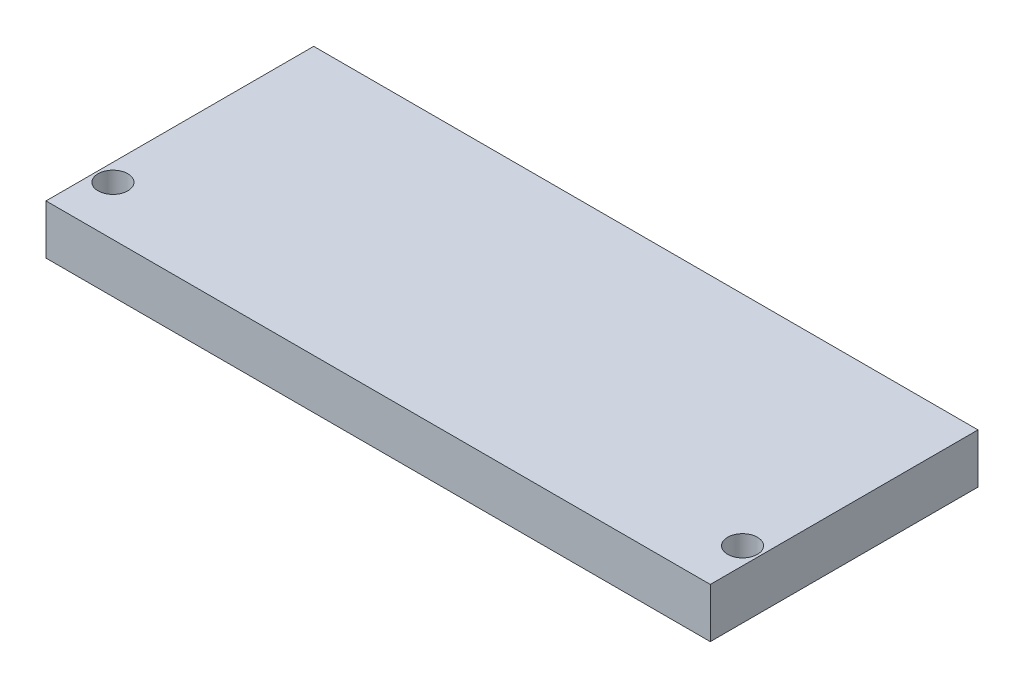
ISO-10303-21;
HEADER;
FILE_DESCRIPTION(('STEP AP214'),'2;1');
FILE_NAME('part.step','',(''),(''),'','','');
FILE_SCHEMA(('AUTOMOTIVE_DESIGN { 1 0 10303 214 1 1 1 1 }'));
ENDSEC;
DATA;
#1=APPLICATION_CONTEXT('core data for automotive mechanical design processes');
#2=APPLICATION_PROTOCOL_DEFINITION('international standard','automotive_design',2000,#1);
#3=PRODUCT_CONTEXT('',#1,'mechanical');
#4=PRODUCT('Part','Part','',(#3));
#5=PRODUCT_RELATED_PRODUCT_CATEGORY('part','',(#4));
#6=PRODUCT_DEFINITION_FORMATION('','',#4);
#7=PRODUCT_DEFINITION_CONTEXT('part definition',#1,'design');
#8=PRODUCT_DEFINITION('design','',#6,#7);
#9=PRODUCT_DEFINITION_SHAPE('','',#8);
#10=(LENGTH_UNIT() NAMED_UNIT(*) SI_UNIT(.MILLI.,.METRE.));
#11=(NAMED_UNIT(*) PLANE_ANGLE_UNIT() SI_UNIT($,.RADIAN.));
#12=(NAMED_UNIT(*) SI_UNIT($,.STERADIAN.) SOLID_ANGLE_UNIT());
#13=UNCERTAINTY_MEASURE_WITH_UNIT(LENGTH_MEASURE(1.E-05),#10,'distance_accuracy_value','');
#14=(GEOMETRIC_REPRESENTATION_CONTEXT(3) GLOBAL_UNCERTAINTY_ASSIGNED_CONTEXT((#13)) GLOBAL_UNIT_ASSIGNED_CONTEXT((#10,
#11,#12)) REPRESENTATION_CONTEXT('',''));
#15=CARTESIAN_POINT('',(0.,0.,0.));
#16=DIRECTION('',(0.,0.,1.));
#17=DIRECTION('',(1.,0.,0.));
#18=AXIS2_PLACEMENT_3D('',#15,#16,#17);
#19=CARTESIAN_POINT('',(0.,5.,0.));
#20=DIRECTION('',(0.,-1.,0.));
#21=DIRECTION('',(0.,0.,-1.));
#22=AXIS2_PLACEMENT_3D('',#19,#20,#21);
#23=PLANE('',#22);
#24=DIRECTION('',(0.,0.,-1.));
#25=VECTOR('',#24,1.);
#26=CARTESIAN_POINT('',(33.5,5.,13.5));
#27=LINE('',#26,#25);
#28=CARTESIAN_POINT('',(33.5,5.,13.5));
#29=VERTEX_POINT('',#28);
#30=CARTESIAN_POINT('',(33.5,5.,-13.5));
#31=VERTEX_POINT('',#30);
#32=EDGE_CURVE('E98',#29,#31,#27,.T.);
#33=ORIENTED_EDGE('',*,*,#32,.T.);
#34=DIRECTION('',(-1.,0.,0.));
#35=VECTOR('',#34,1.);
#36=CARTESIAN_POINT('',(-33.5,5.,-13.5));
#37=LINE('',#36,#35);
#38=CARTESIAN_POINT('',(-33.5,5.,-13.5));
#39=VERTEX_POINT('',#38);
#40=EDGE_CURVE('E93',#31,#39,#37,.T.);
#41=ORIENTED_EDGE('',*,*,#40,.T.);
#42=DIRECTION('',(0.,0.,1.));
#43=VECTOR('',#42,1.);
#44=CARTESIAN_POINT('',(-33.5,5.,13.5));
#45=LINE('',#44,#43);
#46=CARTESIAN_POINT('',(-33.5,5.,13.5));
#47=VERTEX_POINT('',#46);
#48=EDGE_CURVE('E96',#39,#47,#45,.T.);
#49=ORIENTED_EDGE('',*,*,#48,.T.);
#50=DIRECTION('',(1.,0.,0.));
#51=VECTOR('',#50,1.);
#52=CARTESIAN_POINT('',(-33.5,5.,13.5));
#53=LINE('',#52,#51);
#54=EDGE_CURVE('E63',#47,#29,#53,.T.);
#55=ORIENTED_EDGE('',*,*,#54,.T.);
#56=EDGE_LOOP('',(#33,#41,#49,#55));
#57=FACE_BOUND('',#56,.T.);
#58=CARTESIAN_POINT('',(-31.75,5.,8.5));
#59=DIRECTION('',(0.,1.,0.));
#60=DIRECTION('',(0.,0.,1.));
#61=AXIS2_PLACEMENT_3D('',#58,#59,#60);
#62=CIRCLE('',#61,1.5);
#63=CARTESIAN_POINT('',(-31.75,5.,10.));
#64=VERTEX_POINT('',#63);
#65=EDGE_CURVE('E118',#64,#64,#62,.T.);
#66=ORIENTED_EDGE('',*,*,#65,.F.);
#67=EDGE_LOOP('',(#66));
#68=FACE_BOUND('',#67,.T.);
#69=CARTESIAN_POINT('',(31.75,5.,8.5));
#70=DIRECTION('',(0.,1.,0.));
#71=DIRECTION('',(0.,0.,-1.));
#72=AXIS2_PLACEMENT_3D('',#69,#70,#71);
#73=CIRCLE('',#72,1.5);
#74=CARTESIAN_POINT('',(31.75,5.,7.));
#75=VERTEX_POINT('',#74);
#76=EDGE_CURVE('E140',#75,#75,#73,.T.);
#77=ORIENTED_EDGE('',*,*,#76,.F.);
#78=EDGE_LOOP('',(#77));
#79=FACE_BOUND('',#78,.T.);
#80=ADVANCED_FACE('F45',(#57,#68,#79),#23,.F.);
#81=CARTESIAN_POINT('',(0.,0.,0.));
#82=DIRECTION('',(0.,-1.,0.));
#83=DIRECTION('',(0.,0.,-1.));
#84=AXIS2_PLACEMENT_3D('',#81,#82,#83);
#85=PLANE('',#84);
#86=CARTESIAN_POINT('',(-31.75,0.,8.5));
#87=DIRECTION('',(0.,1.,0.));
#88=DIRECTION('',(0.,0.,1.));
#89=AXIS2_PLACEMENT_3D('',#86,#87,#88);
#90=CIRCLE('',#89,1.5);
#91=CARTESIAN_POINT('',(-31.75,0.,10.));
#92=VERTEX_POINT('',#91);
#93=EDGE_CURVE('E136',#92,#92,#90,.T.);
#94=ORIENTED_EDGE('',*,*,#93,.T.);
#95=EDGE_LOOP('',(#94));
#96=FACE_BOUND('',#95,.T.);
#97=DIRECTION('',(0.,0.,-1.));
#98=VECTOR('',#97,1.);
#99=CARTESIAN_POINT('',(33.5,0.,13.5));
#100=LINE('',#99,#98);
#101=CARTESIAN_POINT('',(33.5,0.,13.5));
#102=VERTEX_POINT('',#101);
#103=CARTESIAN_POINT('',(33.5,0.,-13.5));
#104=VERTEX_POINT('',#103);
#105=EDGE_CURVE('E114',#102,#104,#100,.T.);
#106=ORIENTED_EDGE('',*,*,#105,.F.);
#107=DIRECTION('',(1.,0.,0.));
#108=VECTOR('',#107,1.);
#109=CARTESIAN_POINT('',(-33.5,0.,13.5));
#110=LINE('',#109,#108);
#111=CARTESIAN_POINT('',(-33.5,0.,13.5));
#112=VERTEX_POINT('',#111);
#113=EDGE_CURVE('E86',#112,#102,#110,.T.);
#114=ORIENTED_EDGE('',*,*,#113,.F.);
#115=DIRECTION('',(0.,0.,1.));
#116=VECTOR('',#115,1.);
#117=CARTESIAN_POINT('',(-33.5,0.,13.5));
#118=LINE('',#117,#116);
#119=CARTESIAN_POINT('',(-33.5,0.,-13.5));
#120=VERTEX_POINT('',#119);
#121=EDGE_CURVE('E80',#120,#112,#118,.T.);
#122=ORIENTED_EDGE('',*,*,#121,.F.);
#123=DIRECTION('',(-1.,0.,0.));
#124=VECTOR('',#123,1.);
#125=CARTESIAN_POINT('',(-33.5,0.,-13.5));
#126=LINE('',#125,#124);
#127=EDGE_CURVE('E103',#104,#120,#126,.T.);
#128=ORIENTED_EDGE('',*,*,#127,.F.);
#129=EDGE_LOOP('',(#106,#114,#122,#128));
#130=FACE_BOUND('',#129,.T.);
#131=CARTESIAN_POINT('',(31.75,0.,8.5));
#132=DIRECTION('',(0.,1.,0.));
#133=DIRECTION('',(0.,0.,-1.));
#134=AXIS2_PLACEMENT_3D('',#131,#132,#133);
#135=CIRCLE('',#134,1.5);
#136=CARTESIAN_POINT('',(31.75,0.,7.));
#137=VERTEX_POINT('',#136);
#138=EDGE_CURVE('E144',#137,#137,#135,.T.);
#139=ORIENTED_EDGE('',*,*,#138,.T.);
#140=EDGE_LOOP('',(#139));
#141=FACE_BOUND('',#140,.T.);
#142=ADVANCED_FACE('F131',(#96,#130,#141),#85,.T.);
#143=CARTESIAN_POINT('',(33.5,5.,13.5));
#144=DIRECTION('',(-1.,0.,0.));
#145=DIRECTION('',(0.,0.,1.));
#146=AXIS2_PLACEMENT_3D('',#143,#144,#145);
#147=PLANE('',#146);
#148=ORIENTED_EDGE('',*,*,#105,.T.);
#149=DIRECTION('',(0.,-1.,0.));
#150=VECTOR('',#149,1.);
#151=CARTESIAN_POINT('',(33.5,5.,-13.5));
#152=LINE('',#151,#150);
#153=EDGE_CURVE('E11',#31,#104,#152,.T.);
#154=ORIENTED_EDGE('',*,*,#153,.F.);
#155=ORIENTED_EDGE('',*,*,#32,.F.);
#156=DIRECTION('',(0.,-1.,0.));
#157=VECTOR('',#156,1.);
#158=CARTESIAN_POINT('',(33.5,5.,13.5));
#159=LINE('',#158,#157);
#160=EDGE_CURVE('E110',#29,#102,#159,.T.);
#161=ORIENTED_EDGE('',*,*,#160,.T.);
#162=EDGE_LOOP('',(#148,#154,#155,#161));
#163=FACE_BOUND('',#162,.T.);
#164=ADVANCED_FACE('F47',(#163),#147,.F.);
#165=CARTESIAN_POINT('',(-33.5,5.,-13.5));
#166=DIRECTION('',(0.,0.,1.));
#167=DIRECTION('',(1.,0.,0.));
#168=AXIS2_PLACEMENT_3D('',#165,#166,#167);
#169=PLANE('',#168);
#170=ORIENTED_EDGE('',*,*,#127,.T.);
#171=DIRECTION('',(0.,-1.,0.));
#172=VECTOR('',#171,1.);
#173=CARTESIAN_POINT('',(-33.5,5.,-13.5));
#174=LINE('',#173,#172);
#175=EDGE_CURVE('E55',#39,#120,#174,.T.);
#176=ORIENTED_EDGE('',*,*,#175,.F.);
#177=ORIENTED_EDGE('',*,*,#40,.F.);
#178=ORIENTED_EDGE('',*,*,#153,.T.);
#179=EDGE_LOOP('',(#170,#176,#177,#178));
#180=FACE_BOUND('',#179,.T.);
#181=ADVANCED_FACE('F102',(#180),#169,.F.);
#182=CARTESIAN_POINT('',(-33.5,5.,13.5));
#183=DIRECTION('',(1.,0.,0.));
#184=DIRECTION('',(0.,0.,-1.));
#185=AXIS2_PLACEMENT_3D('',#182,#183,#184);
#186=PLANE('',#185);
#187=ORIENTED_EDGE('',*,*,#121,.T.);
#188=DIRECTION('',(0.,-1.,0.));
#189=VECTOR('',#188,1.);
#190=CARTESIAN_POINT('',(-33.5,5.,13.5));
#191=LINE('',#190,#189);
#192=EDGE_CURVE('E105',#47,#112,#191,.T.);
#193=ORIENTED_EDGE('',*,*,#192,.F.);
#194=ORIENTED_EDGE('',*,*,#48,.F.);
#195=ORIENTED_EDGE('',*,*,#175,.T.);
#196=EDGE_LOOP('',(#187,#193,#194,#195));
#197=FACE_BOUND('',#196,.T.);
#198=ADVANCED_FACE('F106',(#197),#186,.F.);
#199=CARTESIAN_POINT('',(-33.5,5.,13.5));
#200=DIRECTION('',(0.,0.,-1.));
#201=DIRECTION('',(-1.,0.,0.));
#202=AXIS2_PLACEMENT_3D('',#199,#200,#201);
#203=PLANE('',#202);
#204=ORIENTED_EDGE('',*,*,#113,.T.);
#205=ORIENTED_EDGE('',*,*,#160,.F.);
#206=ORIENTED_EDGE('',*,*,#54,.F.);
#207=ORIENTED_EDGE('',*,*,#192,.T.);
#208=EDGE_LOOP('',(#204,#205,#206,#207));
#209=FACE_BOUND('',#208,.T.);
#210=ADVANCED_FACE('F128',(#209),#203,.F.);
#211=CARTESIAN_POINT('',(-31.75,5.,8.5));
#212=DIRECTION('',(0.,-1.,0.));
#213=DIRECTION('',(0.,0.,-1.));
#214=AXIS2_PLACEMENT_3D('',#211,#212,#213);
#215=CYLINDRICAL_SURFACE('',#214,1.5);
#216=ORIENTED_EDGE('',*,*,#65,.T.);
#217=EDGE_LOOP('',(#216));
#218=FACE_BOUND('',#217,.T.);
#219=ORIENTED_EDGE('',*,*,#93,.F.);
#220=EDGE_LOOP('',(#219));
#221=FACE_BOUND('',#220,.T.);
#222=ADVANCED_FACE('F163',(#218,#221),#215,.F.);
#223=CARTESIAN_POINT('',(31.75,5.,8.5));
#224=DIRECTION('',(0.,-1.,0.));
#225=DIRECTION('',(0.,0.,-1.));
#226=AXIS2_PLACEMENT_3D('',#223,#224,#225);
#227=CYLINDRICAL_SURFACE('',#226,1.5);
#228=ORIENTED_EDGE('',*,*,#76,.T.);
#229=EDGE_LOOP('',(#228));
#230=FACE_BOUND('',#229,.T.);
#231=ORIENTED_EDGE('',*,*,#138,.F.);
#232=EDGE_LOOP('',(#231));
#233=FACE_BOUND('',#232,.T.);
#234=ADVANCED_FACE('F152',(#230,#233),#227,.F.);
#235=CLOSED_SHELL('',(#80,#142,#164,#181,#198,#210,#222,#234));
#236=MANIFOLD_SOLID_BREP('B2',#235);
#237=ADVANCED_BREP_SHAPE_REPRESENTATION('',(#18,#236),#14);
#238=SHAPE_DEFINITION_REPRESENTATION(#9,#237);
ENDSEC;
END-ISO-10303-21;
